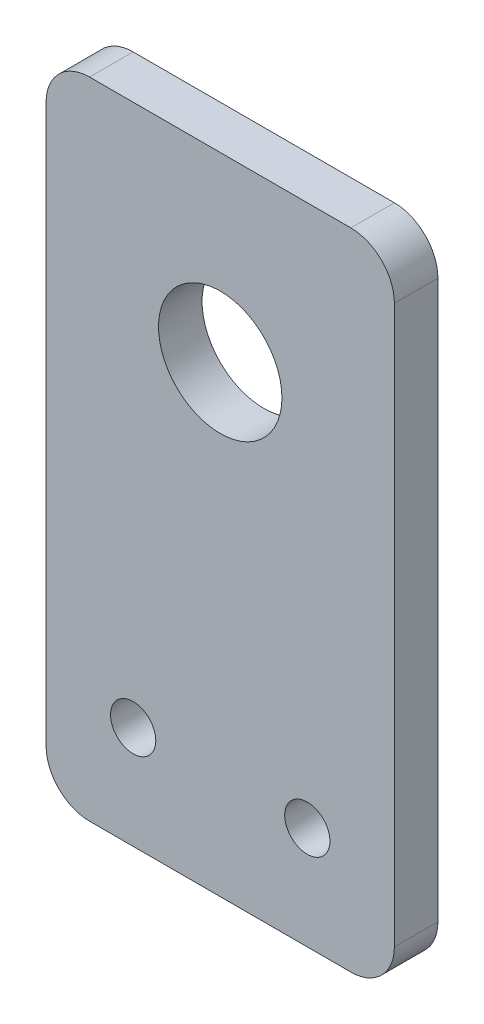
ISO-10303-21;
HEADER;
FILE_DESCRIPTION(('STEP AP214'),'2;1');
FILE_NAME('part.step','',(''),(''),'','','');
FILE_SCHEMA(('AUTOMOTIVE_DESIGN { 1 0 10303 214 1 1 1 1 }'));
ENDSEC;
DATA;
#1=APPLICATION_CONTEXT('core data for automotive mechanical design processes');
#2=APPLICATION_PROTOCOL_DEFINITION('international standard','automotive_design',2000,#1);
#3=PRODUCT_CONTEXT('',#1,'mechanical');
#4=PRODUCT('Part','Part','',(#3));
#5=PRODUCT_RELATED_PRODUCT_CATEGORY('part','',(#4));
#6=PRODUCT_DEFINITION_FORMATION('','',#4);
#7=PRODUCT_DEFINITION_CONTEXT('part definition',#1,'design');
#8=PRODUCT_DEFINITION('design','',#6,#7);
#9=PRODUCT_DEFINITION_SHAPE('','',#8);
#10=(LENGTH_UNIT() NAMED_UNIT(*) SI_UNIT(.MILLI.,.METRE.));
#11=(NAMED_UNIT(*) PLANE_ANGLE_UNIT() SI_UNIT($,.RADIAN.));
#12=(NAMED_UNIT(*) SI_UNIT($,.STERADIAN.) SOLID_ANGLE_UNIT());
#13=UNCERTAINTY_MEASURE_WITH_UNIT(LENGTH_MEASURE(1.E-05),#10,'distance_accuracy_value','');
#14=(GEOMETRIC_REPRESENTATION_CONTEXT(3) GLOBAL_UNCERTAINTY_ASSIGNED_CONTEXT((#13)) GLOBAL_UNIT_ASSIGNED_CONTEXT((#10,
#11,#12)) REPRESENTATION_CONTEXT('',''));
#15=CARTESIAN_POINT('',(0.,0.,0.));
#16=DIRECTION('',(0.,0.,1.));
#17=DIRECTION('',(1.,0.,0.));
#18=AXIS2_PLACEMENT_3D('',#15,#16,#17);
#19=CARTESIAN_POINT('',(0.,0.,0.));
#20=DIRECTION('',(0.,0.,-1.));
#21=DIRECTION('',(-1.,0.,0.));
#22=AXIS2_PLACEMENT_3D('',#19,#20,#21);
#23=PLANE('',#22);
#24=DIRECTION('',(1.,0.,0.));
#25=VECTOR('',#24,1.);
#26=CARTESIAN_POINT('',(-12.7,-23.5,0.));
#27=LINE('',#26,#25);
#28=CARTESIAN_POINT('',(-9.525,-23.5,0.));
#29=VERTEX_POINT('',#28);
#30=CARTESIAN_POINT('',(9.525,-23.5,0.));
#31=VERTEX_POINT('',#30);
#32=EDGE_CURVE('E121',#29,#31,#27,.T.);
#33=ORIENTED_EDGE('',*,*,#32,.F.);
#34=CARTESIAN_POINT('',(-9.525,-20.325,0.));
#35=DIRECTION('',(0.,0.,-1.));
#36=DIRECTION('',(-1.,0.,0.));
#37=AXIS2_PLACEMENT_3D('',#34,#35,#36);
#38=CIRCLE('',#37,3.175);
#39=CARTESIAN_POINT('',(-12.7,-20.325,0.));
#40=VERTEX_POINT('',#39);
#41=EDGE_CURVE('E104',#29,#40,#38,.T.);
#42=ORIENTED_EDGE('',*,*,#41,.T.);
#43=DIRECTION('',(0.,-1.,0.));
#44=VECTOR('',#43,1.);
#45=CARTESIAN_POINT('',(-12.7,-23.5,0.));
#46=LINE('',#45,#44);
#47=CARTESIAN_POINT('',(-12.7,20.325,0.));
#48=VERTEX_POINT('',#47);
#49=EDGE_CURVE('E131',#48,#40,#46,.T.);
#50=ORIENTED_EDGE('',*,*,#49,.F.);
#51=CARTESIAN_POINT('',(-9.525,20.325,0.));
#52=DIRECTION('',(0.,0.,-1.));
#53=DIRECTION('',(-1.,0.,0.));
#54=AXIS2_PLACEMENT_3D('',#51,#52,#53);
#55=CIRCLE('',#54,3.175);
#56=CARTESIAN_POINT('',(-9.525,23.5,0.));
#57=VERTEX_POINT('',#56);
#58=EDGE_CURVE('E125',#48,#57,#55,.T.);
#59=ORIENTED_EDGE('',*,*,#58,.T.);
#60=DIRECTION('',(-1.,0.,0.));
#61=VECTOR('',#60,1.);
#62=CARTESIAN_POINT('',(-12.7,23.5,0.));
#63=LINE('',#62,#61);
#64=CARTESIAN_POINT('',(9.525,23.5,0.));
#65=VERTEX_POINT('',#64);
#66=EDGE_CURVE('E135',#65,#57,#63,.T.);
#67=ORIENTED_EDGE('',*,*,#66,.F.);
#68=CARTESIAN_POINT('',(9.525,20.325,0.));
#69=DIRECTION('',(0.,0.,-1.));
#70=DIRECTION('',(-1.,0.,0.));
#71=AXIS2_PLACEMENT_3D('',#68,#69,#70);
#72=CIRCLE('',#71,3.175);
#73=CARTESIAN_POINT('',(12.7,20.325,0.));
#74=VERTEX_POINT('',#73);
#75=EDGE_CURVE('E141',#65,#74,#72,.T.);
#76=ORIENTED_EDGE('',*,*,#75,.T.);
#77=DIRECTION('',(0.,1.,0.));
#78=VECTOR('',#77,1.);
#79=CARTESIAN_POINT('',(12.7,-23.5,0.));
#80=LINE('',#79,#78);
#81=CARTESIAN_POINT('',(12.7,-20.325,0.));
#82=VERTEX_POINT('',#81);
#83=EDGE_CURVE('E163',#82,#74,#80,.T.);
#84=ORIENTED_EDGE('',*,*,#83,.F.);
#85=CARTESIAN_POINT('',(9.525,-20.325,0.));
#86=DIRECTION('',(0.,0.,-1.));
#87=DIRECTION('',(-1.,0.,0.));
#88=AXIS2_PLACEMENT_3D('',#85,#86,#87);
#89=CIRCLE('',#88,3.175);
#90=EDGE_CURVE('E115',#82,#31,#89,.T.);
#91=ORIENTED_EDGE('',*,*,#90,.T.);
#92=EDGE_LOOP('',(#33,#42,#50,#59,#67,#76,#84,#91));
#93=FACE_BOUND('',#92,.T.);
#94=CARTESIAN_POINT('',(0.,10.25,0.));
#95=DIRECTION('',(0.,0.,1.));
#96=DIRECTION('',(1.,0.,0.));
#97=AXIS2_PLACEMENT_3D('',#94,#95,#96);
#98=CIRCLE('',#97,4.5);
#99=CARTESIAN_POINT('',(4.5,10.25,0.));
#100=VERTEX_POINT('',#99);
#101=EDGE_CURVE('E168',#100,#100,#98,.T.);
#102=ORIENTED_EDGE('',*,*,#101,.T.);
#103=EDGE_LOOP('',(#102));
#104=FACE_BOUND('',#103,.T.);
#105=CARTESIAN_POINT('',(6.35,-16.,0.));
#106=DIRECTION('',(0.,0.,1.));
#107=DIRECTION('',(1.,0.,0.));
#108=AXIS2_PLACEMENT_3D('',#105,#106,#107);
#109=CIRCLE('',#108,1.65);
#110=CARTESIAN_POINT('',(8.,-16.,0.));
#111=VERTEX_POINT('',#110);
#112=EDGE_CURVE('E180',#111,#111,#109,.T.);
#113=ORIENTED_EDGE('',*,*,#112,.T.);
#114=EDGE_LOOP('',(#113));
#115=FACE_BOUND('',#114,.T.);
#116=CARTESIAN_POINT('',(-6.35,-16.,0.));
#117=DIRECTION('',(0.,0.,1.));
#118=DIRECTION('',(1.,0.,0.));
#119=AXIS2_PLACEMENT_3D('',#116,#117,#118);
#120=CIRCLE('',#119,1.65);
#121=CARTESIAN_POINT('',(-4.7,-16.,0.));
#122=VERTEX_POINT('',#121);
#123=EDGE_CURVE('E187',#122,#122,#120,.T.);
#124=ORIENTED_EDGE('',*,*,#123,.T.);
#125=EDGE_LOOP('',(#124));
#126=FACE_BOUND('',#125,.T.);
#127=ADVANCED_FACE('F38',(#93,#104,#115,#126),#23,.T.);
#128=CARTESIAN_POINT('',(12.7,-23.5,3.175));
#129=DIRECTION('',(-1.,0.,0.));
#130=DIRECTION('',(0.,0.,1.));
#131=AXIS2_PLACEMENT_3D('',#128,#129,#130);
#132=PLANE('',#131);
#133=DIRECTION('',(0.,1.,0.));
#134=VECTOR('',#133,1.);
#135=CARTESIAN_POINT('',(12.7,-23.5,3.175));
#136=LINE('',#135,#134);
#137=CARTESIAN_POINT('',(12.7,-20.325,3.175));
#138=VERTEX_POINT('',#137);
#139=CARTESIAN_POINT('',(12.7,20.325,3.175));
#140=VERTEX_POINT('',#139);
#141=EDGE_CURVE('E130',#138,#140,#136,.T.);
#142=ORIENTED_EDGE('',*,*,#141,.F.);
#143=DIRECTION('',(0.,0.,-1.));
#144=VECTOR('',#143,1.);
#145=CARTESIAN_POINT('',(12.7,-20.325,3.175));
#146=LINE('',#145,#144);
#147=EDGE_CURVE('E156',#138,#82,#146,.T.);
#148=ORIENTED_EDGE('',*,*,#147,.T.);
#149=ORIENTED_EDGE('',*,*,#83,.T.);
#150=DIRECTION('',(0.,0.,-1.));
#151=VECTOR('',#150,1.);
#152=CARTESIAN_POINT('',(12.7,20.325,3.175));
#153=LINE('',#152,#151);
#154=EDGE_CURVE('E154',#74,#140,#153,.F.);
#155=ORIENTED_EDGE('',*,*,#154,.T.);
#156=EDGE_LOOP('',(#142,#148,#149,#155));
#157=FACE_BOUND('',#156,.T.);
#158=ADVANCED_FACE('F162',(#157),#132,.F.);
#159=CARTESIAN_POINT('',(-12.7,23.5,3.175));
#160=DIRECTION('',(0.,-1.,0.));
#161=DIRECTION('',(0.,0.,-1.));
#162=AXIS2_PLACEMENT_3D('',#159,#160,#161);
#163=PLANE('',#162);
#164=DIRECTION('',(-1.,0.,0.));
#165=VECTOR('',#164,1.);
#166=CARTESIAN_POINT('',(-12.7,23.5,3.175));
#167=LINE('',#166,#165);
#168=CARTESIAN_POINT('',(9.525,23.5,3.175));
#169=VERTEX_POINT('',#168);
#170=CARTESIAN_POINT('',(-9.525,23.5,3.175));
#171=VERTEX_POINT('',#170);
#172=EDGE_CURVE('E133',#169,#171,#167,.T.);
#173=ORIENTED_EDGE('',*,*,#172,.F.);
#174=DIRECTION('',(0.,0.,-1.));
#175=VECTOR('',#174,1.);
#176=CARTESIAN_POINT('',(9.525,23.5,3.175));
#177=LINE('',#176,#175);
#178=EDGE_CURVE('E11',#169,#65,#177,.T.);
#179=ORIENTED_EDGE('',*,*,#178,.T.);
#180=ORIENTED_EDGE('',*,*,#66,.T.);
#181=DIRECTION('',(0.,0.,-1.));
#182=VECTOR('',#181,1.);
#183=CARTESIAN_POINT('',(-9.525,23.5,3.175));
#184=LINE('',#183,#182);
#185=EDGE_CURVE('E46',#57,#171,#184,.F.);
#186=ORIENTED_EDGE('',*,*,#185,.T.);
#187=EDGE_LOOP('',(#173,#179,#180,#186));
#188=FACE_BOUND('',#187,.T.);
#189=ADVANCED_FACE('F210',(#188),#163,.F.);
#190=CARTESIAN_POINT('',(-12.7,-23.5,3.175));
#191=DIRECTION('',(1.,0.,0.));
#192=DIRECTION('',(0.,0.,-1.));
#193=AXIS2_PLACEMENT_3D('',#190,#191,#192);
#194=PLANE('',#193);
#195=ORIENTED_EDGE('',*,*,#49,.T.);
#196=DIRECTION('',(0.,0.,-1.));
#197=VECTOR('',#196,1.);
#198=CARTESIAN_POINT('',(-12.7,-20.325,3.175));
#199=LINE('',#198,#197);
#200=CARTESIAN_POINT('',(-12.7,-20.325,3.175));
#201=VERTEX_POINT('',#200);
#202=EDGE_CURVE('E109',#40,#201,#199,.F.);
#203=ORIENTED_EDGE('',*,*,#202,.T.);
#204=DIRECTION('',(0.,-1.,0.));
#205=VECTOR('',#204,1.);
#206=CARTESIAN_POINT('',(-12.7,-23.5,3.175));
#207=LINE('',#206,#205);
#208=CARTESIAN_POINT('',(-12.7,20.325,3.175));
#209=VERTEX_POINT('',#208);
#210=EDGE_CURVE('E175',#209,#201,#207,.T.);
#211=ORIENTED_EDGE('',*,*,#210,.F.);
#212=DIRECTION('',(0.,0.,-1.));
#213=VECTOR('',#212,1.);
#214=CARTESIAN_POINT('',(-12.7,20.325,3.175));
#215=LINE('',#214,#213);
#216=EDGE_CURVE('E114',#209,#48,#215,.T.);
#217=ORIENTED_EDGE('',*,*,#216,.T.);
#218=EDGE_LOOP('',(#195,#203,#211,#217));
#219=FACE_BOUND('',#218,.T.);
#220=ADVANCED_FACE('F208',(#219),#194,.F.);
#221=CARTESIAN_POINT('',(-12.7,-23.5,3.175));
#222=DIRECTION('',(0.,1.,0.));
#223=DIRECTION('',(0.,0.,1.));
#224=AXIS2_PLACEMENT_3D('',#221,#222,#223);
#225=PLANE('',#224);
#226=DIRECTION('',(1.,0.,0.));
#227=VECTOR('',#226,1.);
#228=CARTESIAN_POINT('',(-12.7,-23.5,3.175));
#229=LINE('',#228,#227);
#230=CARTESIAN_POINT('',(-9.525,-23.5,3.175));
#231=VERTEX_POINT('',#230);
#232=CARTESIAN_POINT('',(9.525,-23.5,3.175));
#233=VERTEX_POINT('',#232);
#234=EDGE_CURVE('E124',#231,#233,#229,.T.);
#235=ORIENTED_EDGE('',*,*,#234,.F.);
#236=DIRECTION('',(0.,0.,-1.));
#237=VECTOR('',#236,1.);
#238=CARTESIAN_POINT('',(-9.525,-23.5,3.175));
#239=LINE('',#238,#237);
#240=EDGE_CURVE('E108',#231,#29,#239,.T.);
#241=ORIENTED_EDGE('',*,*,#240,.T.);
#242=ORIENTED_EDGE('',*,*,#32,.T.);
#243=DIRECTION('',(0.,0.,-1.));
#244=VECTOR('',#243,1.);
#245=CARTESIAN_POINT('',(9.525,-23.5,3.175));
#246=LINE('',#245,#244);
#247=EDGE_CURVE('E126',#31,#233,#246,.F.);
#248=ORIENTED_EDGE('',*,*,#247,.T.);
#249=EDGE_LOOP('',(#235,#241,#242,#248));
#250=FACE_BOUND('',#249,.T.);
#251=ADVANCED_FACE('F120',(#250),#225,.F.);
#252=CARTESIAN_POINT('',(0.,0.,3.175));
#253=DIRECTION('',(0.,0.,-1.));
#254=DIRECTION('',(-1.,0.,0.));
#255=AXIS2_PLACEMENT_3D('',#252,#253,#254);
#256=PLANE('',#255);
#257=CARTESIAN_POINT('',(-6.35,-16.,3.175));
#258=DIRECTION('',(0.,0.,1.));
#259=DIRECTION('',(1.,0.,0.));
#260=AXIS2_PLACEMENT_3D('',#257,#258,#259);
#261=CIRCLE('',#260,1.65);
#262=CARTESIAN_POINT('',(-4.7,-16.,3.175));
#263=VERTEX_POINT('',#262);
#264=EDGE_CURVE('E190',#263,#263,#261,.T.);
#265=ORIENTED_EDGE('',*,*,#264,.F.);
#266=EDGE_LOOP('',(#265));
#267=FACE_BOUND('',#266,.T.);
#268=CARTESIAN_POINT('',(6.35,-16.,3.175));
#269=DIRECTION('',(0.,0.,1.));
#270=DIRECTION('',(1.,0.,0.));
#271=AXIS2_PLACEMENT_3D('',#268,#269,#270);
#272=CIRCLE('',#271,1.65);
#273=CARTESIAN_POINT('',(8.,-16.,3.175));
#274=VERTEX_POINT('',#273);
#275=EDGE_CURVE('E184',#274,#274,#272,.T.);
#276=ORIENTED_EDGE('',*,*,#275,.F.);
#277=EDGE_LOOP('',(#276));
#278=FACE_BOUND('',#277,.T.);
#279=CARTESIAN_POINT('',(0.,10.25,3.175));
#280=DIRECTION('',(0.,0.,1.));
#281=DIRECTION('',(1.,0.,0.));
#282=AXIS2_PLACEMENT_3D('',#279,#280,#281);
#283=CIRCLE('',#282,4.5);
#284=CARTESIAN_POINT('',(4.5,10.25,3.175));
#285=VERTEX_POINT('',#284);
#286=EDGE_CURVE('E171',#285,#285,#283,.T.);
#287=ORIENTED_EDGE('',*,*,#286,.F.);
#288=EDGE_LOOP('',(#287));
#289=FACE_BOUND('',#288,.T.);
#290=ORIENTED_EDGE('',*,*,#210,.T.);
#291=CARTESIAN_POINT('',(-9.525,-20.325,3.175));
#292=DIRECTION('',(0.,0.,-1.));
#293=DIRECTION('',(-1.,0.,0.));
#294=AXIS2_PLACEMENT_3D('',#291,#292,#293);
#295=CIRCLE('',#294,3.175);
#296=EDGE_CURVE('E152',#201,#231,#295,.F.);
#297=ORIENTED_EDGE('',*,*,#296,.T.);
#298=ORIENTED_EDGE('',*,*,#234,.T.);
#299=CARTESIAN_POINT('',(9.525,-20.325,3.175));
#300=DIRECTION('',(0.,0.,-1.));
#301=DIRECTION('',(-1.,0.,0.));
#302=AXIS2_PLACEMENT_3D('',#299,#300,#301);
#303=CIRCLE('',#302,3.175);
#304=EDGE_CURVE('E150',#233,#138,#303,.F.);
#305=ORIENTED_EDGE('',*,*,#304,.T.);
#306=ORIENTED_EDGE('',*,*,#141,.T.);
#307=CARTESIAN_POINT('',(9.525,20.325,3.175));
#308=DIRECTION('',(0.,0.,-1.));
#309=DIRECTION('',(-1.,0.,0.));
#310=AXIS2_PLACEMENT_3D('',#307,#308,#309);
#311=CIRCLE('',#310,3.175);
#312=EDGE_CURVE('E59',#140,#169,#311,.F.);
#313=ORIENTED_EDGE('',*,*,#312,.T.);
#314=ORIENTED_EDGE('',*,*,#172,.T.);
#315=CARTESIAN_POINT('',(-9.525,20.325,3.175));
#316=DIRECTION('',(0.,0.,-1.));
#317=DIRECTION('',(-1.,0.,0.));
#318=AXIS2_PLACEMENT_3D('',#315,#316,#317);
#319=CIRCLE('',#318,3.175);
#320=EDGE_CURVE('E147',#171,#209,#319,.F.);
#321=ORIENTED_EDGE('',*,*,#320,.T.);
#322=EDGE_LOOP('',(#290,#297,#298,#305,#306,#313,#314,#321));
#323=FACE_BOUND('',#322,.T.);
#324=ADVANCED_FACE('F196',(#267,#278,#289,#323),#256,.F.);
#325=CARTESIAN_POINT('',(0.,10.25,0.));
#326=DIRECTION('',(0.,0.,1.));
#327=DIRECTION('',(1.,0.,0.));
#328=AXIS2_PLACEMENT_3D('',#325,#326,#327);
#329=CYLINDRICAL_SURFACE('',#328,4.5);
#330=ORIENTED_EDGE('',*,*,#101,.F.);
#331=EDGE_LOOP('',(#330));
#332=FACE_BOUND('',#331,.T.);
#333=ORIENTED_EDGE('',*,*,#286,.T.);
#334=EDGE_LOOP('',(#333));
#335=FACE_BOUND('',#334,.T.);
#336=ADVANCED_FACE('F199',(#332,#335),#329,.F.);
#337=CARTESIAN_POINT('',(-9.525,-20.325,3.175));
#338=DIRECTION('',(0.,0.,-1.));
#339=DIRECTION('',(-1.,0.,0.));
#340=AXIS2_PLACEMENT_3D('',#337,#338,#339);
#341=CYLINDRICAL_SURFACE('',#340,3.175);
#342=ORIENTED_EDGE('',*,*,#296,.F.);
#343=ORIENTED_EDGE('',*,*,#202,.F.);
#344=ORIENTED_EDGE('',*,*,#41,.F.);
#345=ORIENTED_EDGE('',*,*,#240,.F.);
#346=EDGE_LOOP('',(#342,#343,#344,#345));
#347=FACE_BOUND('',#346,.T.);
#348=ADVANCED_FACE('F107',(#347),#341,.T.);
#349=CARTESIAN_POINT('',(9.525,-20.325,3.175));
#350=DIRECTION('',(0.,0.,-1.));
#351=DIRECTION('',(-1.,0.,0.));
#352=AXIS2_PLACEMENT_3D('',#349,#350,#351);
#353=CYLINDRICAL_SURFACE('',#352,3.175);
#354=ORIENTED_EDGE('',*,*,#304,.F.);
#355=ORIENTED_EDGE('',*,*,#247,.F.);
#356=ORIENTED_EDGE('',*,*,#90,.F.);
#357=ORIENTED_EDGE('',*,*,#147,.F.);
#358=EDGE_LOOP('',(#354,#355,#356,#357));
#359=FACE_BOUND('',#358,.T.);
#360=ADVANCED_FACE('F214',(#359),#353,.T.);
#361=CARTESIAN_POINT('',(9.525,20.325,3.175));
#362=DIRECTION('',(0.,0.,-1.));
#363=DIRECTION('',(-1.,0.,0.));
#364=AXIS2_PLACEMENT_3D('',#361,#362,#363);
#365=CYLINDRICAL_SURFACE('',#364,3.175);
#366=ORIENTED_EDGE('',*,*,#312,.F.);
#367=ORIENTED_EDGE('',*,*,#154,.F.);
#368=ORIENTED_EDGE('',*,*,#75,.F.);
#369=ORIENTED_EDGE('',*,*,#178,.F.);
#370=EDGE_LOOP('',(#366,#367,#368,#369));
#371=FACE_BOUND('',#370,.T.);
#372=ADVANCED_FACE('F213',(#371),#365,.T.);
#373=CARTESIAN_POINT('',(-9.525,20.325,3.175));
#374=DIRECTION('',(0.,0.,-1.));
#375=DIRECTION('',(-1.,0.,0.));
#376=AXIS2_PLACEMENT_3D('',#373,#374,#375);
#377=CYLINDRICAL_SURFACE('',#376,3.175);
#378=ORIENTED_EDGE('',*,*,#320,.F.);
#379=ORIENTED_EDGE('',*,*,#185,.F.);
#380=ORIENTED_EDGE('',*,*,#58,.F.);
#381=ORIENTED_EDGE('',*,*,#216,.F.);
#382=EDGE_LOOP('',(#378,#379,#380,#381));
#383=FACE_BOUND('',#382,.T.);
#384=ADVANCED_FACE('F40',(#383),#377,.T.);
#385=CARTESIAN_POINT('',(6.35,-16.,3.175));
#386=DIRECTION('',(0.,0.,1.));
#387=DIRECTION('',(1.,0.,0.));
#388=AXIS2_PLACEMENT_3D('',#385,#386,#387);
#389=CYLINDRICAL_SURFACE('',#388,1.65);
#390=ORIENTED_EDGE('',*,*,#112,.F.);
#391=EDGE_LOOP('',(#390));
#392=FACE_BOUND('',#391,.T.);
#393=ORIENTED_EDGE('',*,*,#275,.T.);
#394=EDGE_LOOP('',(#393));
#395=FACE_BOUND('',#394,.T.);
#396=ADVANCED_FACE('F283',(#392,#395),#389,.F.);
#397=CARTESIAN_POINT('',(-6.35,-16.,3.175));
#398=DIRECTION('',(0.,0.,1.));
#399=DIRECTION('',(1.,0.,0.));
#400=AXIS2_PLACEMENT_3D('',#397,#398,#399);
#401=CYLINDRICAL_SURFACE('',#400,1.65);
#402=ORIENTED_EDGE('',*,*,#123,.F.);
#403=EDGE_LOOP('',(#402));
#404=FACE_BOUND('',#403,.T.);
#405=ORIENTED_EDGE('',*,*,#264,.T.);
#406=EDGE_LOOP('',(#405));
#407=FACE_BOUND('',#406,.T.);
#408=ADVANCED_FACE('F194',(#404,#407),#401,.F.);
#409=CLOSED_SHELL('',(#127,#158,#189,#220,#251,#324,#336,#348,#360,#372,#384,#396,#408));
#410=MANIFOLD_SOLID_BREP('B2',#409);
#411=ADVANCED_BREP_SHAPE_REPRESENTATION('',(#18,#410),#14);
#412=SHAPE_DEFINITION_REPRESENTATION(#9,#411);
ENDSEC;
END-ISO-10303-21;
